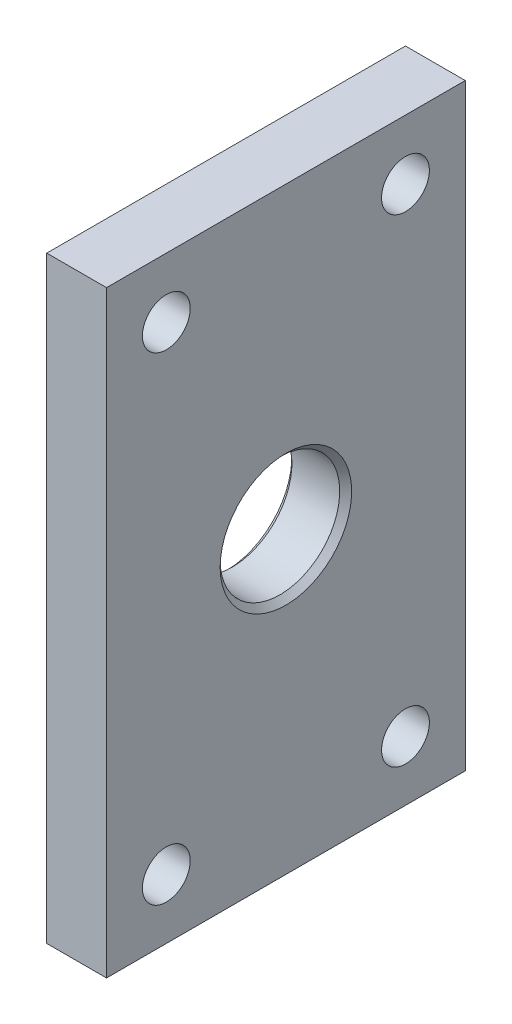
ISO-10303-21;
HEADER;
FILE_DESCRIPTION(('STEP AP214'),'2;1');
FILE_NAME('part.step','',(''),(''),'','','');
FILE_SCHEMA(('AUTOMOTIVE_DESIGN { 1 0 10303 214 1 1 1 1 }'));
ENDSEC;
DATA;
#1=APPLICATION_CONTEXT('core data for automotive mechanical design processes');
#2=APPLICATION_PROTOCOL_DEFINITION('international standard','automotive_design',2000,#1);
#3=PRODUCT_CONTEXT('',#1,'mechanical');
#4=PRODUCT('Part','Part','',(#3));
#5=PRODUCT_RELATED_PRODUCT_CATEGORY('part','',(#4));
#6=PRODUCT_DEFINITION_FORMATION('','',#4);
#7=PRODUCT_DEFINITION_CONTEXT('part definition',#1,'design');
#8=PRODUCT_DEFINITION('design','',#6,#7);
#9=PRODUCT_DEFINITION_SHAPE('','',#8);
#10=(LENGTH_UNIT() NAMED_UNIT(*) SI_UNIT(.MILLI.,.METRE.));
#11=(NAMED_UNIT(*) PLANE_ANGLE_UNIT() SI_UNIT($,.RADIAN.));
#12=(NAMED_UNIT(*) SI_UNIT($,.STERADIAN.) SOLID_ANGLE_UNIT());
#13=UNCERTAINTY_MEASURE_WITH_UNIT(LENGTH_MEASURE(1.E-05),#10,'distance_accuracy_value','');
#14=(GEOMETRIC_REPRESENTATION_CONTEXT(3) GLOBAL_UNCERTAINTY_ASSIGNED_CONTEXT((#13)) GLOBAL_UNIT_ASSIGNED_CONTEXT((#10,
#11,#12)) REPRESENTATION_CONTEXT('',''));
#15=CARTESIAN_POINT('',(0.,0.,0.));
#16=DIRECTION('',(0.,0.,1.));
#17=DIRECTION('',(1.,0.,0.));
#18=AXIS2_PLACEMENT_3D('',#15,#16,#17);
#19=CARTESIAN_POINT('',(10.,0.,0.));
#20=DIRECTION('',(0.,1.,0.));
#21=DIRECTION('',(0.,0.,1.));
#22=AXIS2_PLACEMENT_3D('',#19,#20,#21);
#23=PLANE('',#22);
#24=DIRECTION('',(0.,0.,-1.));
#25=VECTOR('',#24,1.);
#26=CARTESIAN_POINT('',(0.,0.,0.));
#27=LINE('',#26,#25);
#28=CARTESIAN_POINT('',(0.,0.,60.));
#29=VERTEX_POINT('',#28);
#30=CARTESIAN_POINT('',(0.,0.,0.));
#31=VERTEX_POINT('',#30);
#32=EDGE_CURVE('E114',#29,#31,#27,.T.);
#33=ORIENTED_EDGE('',*,*,#32,.T.);
#34=DIRECTION('',(-1.,0.,0.));
#35=VECTOR('',#34,1.);
#36=CARTESIAN_POINT('',(10.,0.,0.));
#37=LINE('',#36,#35);
#38=CARTESIAN_POINT('',(10.,0.,0.));
#39=VERTEX_POINT('',#38);
#40=EDGE_CURVE('E105',#39,#31,#37,.T.);
#41=ORIENTED_EDGE('',*,*,#40,.F.);
#42=DIRECTION('',(0.,0.,-1.));
#43=VECTOR('',#42,1.);
#44=CARTESIAN_POINT('',(10.,0.,0.));
#45=LINE('',#44,#43);
#46=CARTESIAN_POINT('',(10.,0.,60.));
#47=VERTEX_POINT('',#46);
#48=EDGE_CURVE('E99',#47,#39,#45,.T.);
#49=ORIENTED_EDGE('',*,*,#48,.F.);
#50=DIRECTION('',(-1.,0.,0.));
#51=VECTOR('',#50,1.);
#52=CARTESIAN_POINT('',(10.,0.,60.));
#53=LINE('',#52,#51);
#54=EDGE_CURVE('E110',#47,#29,#53,.T.);
#55=ORIENTED_EDGE('',*,*,#54,.T.);
#56=EDGE_LOOP('',(#33,#41,#49,#55));
#57=FACE_BOUND('',#56,.T.);
#58=ADVANCED_FACE('F45',(#57),#23,.F.);
#59=CARTESIAN_POINT('',(10.,0.,0.));
#60=DIRECTION('',(0.,0.,1.));
#61=DIRECTION('',(1.,0.,0.));
#62=AXIS2_PLACEMENT_3D('',#59,#60,#61);
#63=PLANE('',#62);
#64=DIRECTION('',(0.,1.,0.));
#65=VECTOR('',#64,1.);
#66=CARTESIAN_POINT('',(0.,0.,0.));
#67=LINE('',#66,#65);
#68=CARTESIAN_POINT('',(0.,100.,0.));
#69=VERTEX_POINT('',#68);
#70=EDGE_CURVE('E104',#31,#69,#67,.T.);
#71=ORIENTED_EDGE('',*,*,#70,.T.);
#72=DIRECTION('',(-1.,0.,0.));
#73=VECTOR('',#72,1.);
#74=CARTESIAN_POINT('',(10.,100.,0.));
#75=LINE('',#74,#73);
#76=CARTESIAN_POINT('',(10.,100.,0.));
#77=VERTEX_POINT('',#76);
#78=EDGE_CURVE('E102',#77,#69,#75,.T.);
#79=ORIENTED_EDGE('',*,*,#78,.F.);
#80=DIRECTION('',(0.,1.,0.));
#81=VECTOR('',#80,1.);
#82=CARTESIAN_POINT('',(10.,0.,0.));
#83=LINE('',#82,#81);
#84=EDGE_CURVE('E94',#39,#77,#83,.T.);
#85=ORIENTED_EDGE('',*,*,#84,.F.);
#86=ORIENTED_EDGE('',*,*,#40,.T.);
#87=EDGE_LOOP('',(#71,#79,#85,#86));
#88=FACE_BOUND('',#87,.T.);
#89=ADVANCED_FACE('F103',(#88),#63,.F.);
#90=CARTESIAN_POINT('',(10.,100.,0.));
#91=DIRECTION('',(0.,-1.,0.));
#92=DIRECTION('',(0.,0.,-1.));
#93=AXIS2_PLACEMENT_3D('',#90,#91,#92);
#94=PLANE('',#93);
#95=DIRECTION('',(0.,0.,1.));
#96=VECTOR('',#95,1.);
#97=CARTESIAN_POINT('',(0.,100.,0.));
#98=LINE('',#97,#96);
#99=CARTESIAN_POINT('',(0.,100.,60.));
#100=VERTEX_POINT('',#99);
#101=EDGE_CURVE('E80',#69,#100,#98,.T.);
#102=ORIENTED_EDGE('',*,*,#101,.T.);
#103=DIRECTION('',(-1.,0.,0.));
#104=VECTOR('',#103,1.);
#105=CARTESIAN_POINT('',(10.,100.,60.));
#106=LINE('',#105,#104);
#107=CARTESIAN_POINT('',(10.,100.,60.));
#108=VERTEX_POINT('',#107);
#109=EDGE_CURVE('E106',#108,#100,#106,.T.);
#110=ORIENTED_EDGE('',*,*,#109,.F.);
#111=DIRECTION('',(0.,0.,1.));
#112=VECTOR('',#111,1.);
#113=CARTESIAN_POINT('',(10.,100.,0.));
#114=LINE('',#113,#112);
#115=EDGE_CURVE('E97',#77,#108,#114,.T.);
#116=ORIENTED_EDGE('',*,*,#115,.F.);
#117=ORIENTED_EDGE('',*,*,#78,.T.);
#118=EDGE_LOOP('',(#102,#110,#116,#117));
#119=FACE_BOUND('',#118,.T.);
#120=ADVANCED_FACE('F108',(#119),#94,.F.);
#121=CARTESIAN_POINT('',(10.,0.,60.));
#122=DIRECTION('',(0.,0.,-1.));
#123=DIRECTION('',(-1.,0.,0.));
#124=AXIS2_PLACEMENT_3D('',#121,#122,#123);
#125=PLANE('',#124);
#126=DIRECTION('',(0.,-1.,0.));
#127=VECTOR('',#126,1.);
#128=CARTESIAN_POINT('',(0.,0.,60.));
#129=LINE('',#128,#127);
#130=EDGE_CURVE('E86',#100,#29,#129,.T.);
#131=ORIENTED_EDGE('',*,*,#130,.T.);
#132=ORIENTED_EDGE('',*,*,#54,.F.);
#133=DIRECTION('',(0.,-1.,0.));
#134=VECTOR('',#133,1.);
#135=CARTESIAN_POINT('',(10.,0.,60.));
#136=LINE('',#135,#134);
#137=EDGE_CURVE('E63',#108,#47,#136,.T.);
#138=ORIENTED_EDGE('',*,*,#137,.F.);
#139=ORIENTED_EDGE('',*,*,#109,.T.);
#140=EDGE_LOOP('',(#131,#132,#138,#139));
#141=FACE_BOUND('',#140,.T.);
#142=ADVANCED_FACE('F162',(#141),#125,.F.);
#143=CARTESIAN_POINT('',(10.,0.,0.));
#144=DIRECTION('',(-1.,0.,0.));
#145=DIRECTION('',(0.,0.,1.));
#146=AXIS2_PLACEMENT_3D('',#143,#144,#145);
#147=PLANE('',#146);
#148=CARTESIAN_POINT('',(10.,50.,30.));
#149=DIRECTION('',(-1.,0.,0.));
#150=DIRECTION('',(0.,0.,1.));
#151=AXIS2_PLACEMENT_3D('',#148,#149,#150);
#152=CIRCLE('',#151,11.);
#153=CARTESIAN_POINT('',(10.,50.,41.));
#154=VERTEX_POINT('',#153);
#155=EDGE_CURVE('E11',#154,#154,#152,.T.);
#156=ORIENTED_EDGE('',*,*,#155,.T.);
#157=EDGE_LOOP('',(#156));
#158=FACE_BOUND('',#157,.T.);
#159=CARTESIAN_POINT('',(10.,90.,10.));
#160=DIRECTION('',(1.,0.,0.));
#161=DIRECTION('',(0.,0.,-1.));
#162=AXIS2_PLACEMENT_3D('',#159,#160,#161);
#163=CIRCLE('',#162,4.00000000000001);
#164=CARTESIAN_POINT('',(10.,90.,5.99999999999999));
#165=VERTEX_POINT('',#164);
#166=EDGE_CURVE('E278',#165,#165,#163,.T.);
#167=ORIENTED_EDGE('',*,*,#166,.F.);
#168=EDGE_LOOP('',(#167));
#169=FACE_BOUND('',#168,.T.);
#170=CARTESIAN_POINT('',(10.,10.,50.));
#171=DIRECTION('',(1.,0.,0.));
#172=DIRECTION('',(0.,0.,-1.));
#173=AXIS2_PLACEMENT_3D('',#170,#171,#172);
#174=CIRCLE('',#173,4.);
#175=CARTESIAN_POINT('',(10.,10.,46.));
#176=VERTEX_POINT('',#175);
#177=EDGE_CURVE('E282',#176,#176,#174,.T.);
#178=ORIENTED_EDGE('',*,*,#177,.F.);
#179=EDGE_LOOP('',(#178));
#180=FACE_BOUND('',#179,.T.);
#181=CARTESIAN_POINT('',(10.,90.,50.));
#182=DIRECTION('',(1.,0.,0.));
#183=DIRECTION('',(0.,0.,-1.));
#184=AXIS2_PLACEMENT_3D('',#181,#182,#183);
#185=CIRCLE('',#184,4.00000000000001);
#186=CARTESIAN_POINT('',(10.,90.,46.));
#187=VERTEX_POINT('',#186);
#188=EDGE_CURVE('E286',#187,#187,#185,.T.);
#189=ORIENTED_EDGE('',*,*,#188,.F.);
#190=EDGE_LOOP('',(#189));
#191=FACE_BOUND('',#190,.T.);
#192=CARTESIAN_POINT('',(10.,10.,10.));
#193=DIRECTION('',(1.,0.,0.));
#194=DIRECTION('',(0.,0.,-1.));
#195=AXIS2_PLACEMENT_3D('',#192,#193,#194);
#196=CIRCLE('',#195,4.);
#197=CARTESIAN_POINT('',(10.,10.,6.));
#198=VERTEX_POINT('',#197);
#199=EDGE_CURVE('E289',#198,#198,#196,.T.);
#200=ORIENTED_EDGE('',*,*,#199,.F.);
#201=EDGE_LOOP('',(#200));
#202=FACE_BOUND('',#201,.T.);
#203=ORIENTED_EDGE('',*,*,#48,.T.);
#204=ORIENTED_EDGE('',*,*,#84,.T.);
#205=ORIENTED_EDGE('',*,*,#115,.T.);
#206=ORIENTED_EDGE('',*,*,#137,.T.);
#207=EDGE_LOOP('',(#203,#204,#205,#206));
#208=FACE_BOUND('',#207,.T.);
#209=ADVANCED_FACE('F95',(#158,#169,#180,#191,#202,#208),#147,.F.);
#210=CARTESIAN_POINT('',(0.,0.,0.));
#211=DIRECTION('',(-1.,0.,0.));
#212=DIRECTION('',(0.,0.,1.));
#213=AXIS2_PLACEMENT_3D('',#210,#211,#212);
#214=PLANE('',#213);
#215=CARTESIAN_POINT('',(0.,50.,30.));
#216=DIRECTION('',(-1.,0.,0.));
#217=DIRECTION('',(0.,0.,1.));
#218=AXIS2_PLACEMENT_3D('',#215,#216,#217);
#219=CIRCLE('',#218,11.);
#220=CARTESIAN_POINT('',(0.,50.,41.));
#221=VERTEX_POINT('',#220);
#222=EDGE_CURVE('E124',#221,#221,#219,.F.);
#223=ORIENTED_EDGE('',*,*,#222,.T.);
#224=EDGE_LOOP('',(#223));
#225=FACE_BOUND('',#224,.T.);
#226=CARTESIAN_POINT('',(0.,90.,10.));
#227=DIRECTION('',(1.,0.,0.));
#228=DIRECTION('',(0.,0.,-1.));
#229=AXIS2_PLACEMENT_3D('',#226,#227,#228);
#230=CIRCLE('',#229,4.00000000000001);
#231=CARTESIAN_POINT('',(0.,90.,5.99999999999999));
#232=VERTEX_POINT('',#231);
#233=EDGE_CURVE('E148',#232,#232,#230,.T.);
#234=ORIENTED_EDGE('',*,*,#233,.T.);
#235=EDGE_LOOP('',(#234));
#236=FACE_BOUND('',#235,.T.);
#237=CARTESIAN_POINT('',(0.,10.,50.));
#238=DIRECTION('',(1.,0.,0.));
#239=DIRECTION('',(0.,0.,-1.));
#240=AXIS2_PLACEMENT_3D('',#237,#238,#239);
#241=CIRCLE('',#240,4.);
#242=CARTESIAN_POINT('',(0.,10.,46.));
#243=VERTEX_POINT('',#242);
#244=EDGE_CURVE('E152',#243,#243,#241,.T.);
#245=ORIENTED_EDGE('',*,*,#244,.T.);
#246=EDGE_LOOP('',(#245));
#247=FACE_BOUND('',#246,.T.);
#248=CARTESIAN_POINT('',(0.,90.,50.));
#249=DIRECTION('',(1.,0.,0.));
#250=DIRECTION('',(0.,0.,-1.));
#251=AXIS2_PLACEMENT_3D('',#248,#249,#250);
#252=CIRCLE('',#251,4.00000000000001);
#253=CARTESIAN_POINT('',(0.,90.,46.));
#254=VERTEX_POINT('',#253);
#255=EDGE_CURVE('E156',#254,#254,#252,.T.);
#256=ORIENTED_EDGE('',*,*,#255,.T.);
#257=EDGE_LOOP('',(#256));
#258=FACE_BOUND('',#257,.T.);
#259=CARTESIAN_POINT('',(0.,10.,10.));
#260=DIRECTION('',(1.,0.,0.));
#261=DIRECTION('',(0.,0.,-1.));
#262=AXIS2_PLACEMENT_3D('',#259,#260,#261);
#263=CIRCLE('',#262,4.);
#264=CARTESIAN_POINT('',(0.,10.,6.));
#265=VERTEX_POINT('',#264);
#266=EDGE_CURVE('E117',#265,#265,#263,.T.);
#267=ORIENTED_EDGE('',*,*,#266,.T.);
#268=EDGE_LOOP('',(#267));
#269=FACE_BOUND('',#268,.T.);
#270=ORIENTED_EDGE('',*,*,#32,.F.);
#271=ORIENTED_EDGE('',*,*,#130,.F.);
#272=ORIENTED_EDGE('',*,*,#101,.F.);
#273=ORIENTED_EDGE('',*,*,#70,.F.);
#274=EDGE_LOOP('',(#270,#271,#272,#273));
#275=FACE_BOUND('',#274,.T.);
#276=ADVANCED_FACE('F140',(#225,#236,#247,#258,#269,#275),#214,.T.);
#277=CARTESIAN_POINT('',(0.,10.,10.));
#278=DIRECTION('',(1.,0.,0.));
#279=DIRECTION('',(0.,0.,-1.));
#280=AXIS2_PLACEMENT_3D('',#277,#278,#279);
#281=CYLINDRICAL_SURFACE('',#280,4.);
#282=ORIENTED_EDGE('',*,*,#266,.F.);
#283=EDGE_LOOP('',(#282));
#284=FACE_BOUND('',#283,.T.);
#285=ORIENTED_EDGE('',*,*,#199,.T.);
#286=EDGE_LOOP('',(#285));
#287=FACE_BOUND('',#286,.T.);
#288=ADVANCED_FACE('F143',(#284,#287),#281,.F.);
#289=CARTESIAN_POINT('',(0.,90.,50.));
#290=DIRECTION('',(1.,0.,0.));
#291=DIRECTION('',(0.,0.,-1.));
#292=AXIS2_PLACEMENT_3D('',#289,#290,#291);
#293=CYLINDRICAL_SURFACE('',#292,4.00000000000001);
#294=ORIENTED_EDGE('',*,*,#255,.F.);
#295=EDGE_LOOP('',(#294));
#296=FACE_BOUND('',#295,.T.);
#297=ORIENTED_EDGE('',*,*,#188,.T.);
#298=EDGE_LOOP('',(#297));
#299=FACE_BOUND('',#298,.T.);
#300=ADVANCED_FACE('F218',(#296,#299),#293,.F.);
#301=CARTESIAN_POINT('',(0.,10.,50.));
#302=DIRECTION('',(1.,0.,0.));
#303=DIRECTION('',(0.,0.,-1.));
#304=AXIS2_PLACEMENT_3D('',#301,#302,#303);
#305=CYLINDRICAL_SURFACE('',#304,4.);
#306=ORIENTED_EDGE('',*,*,#244,.F.);
#307=EDGE_LOOP('',(#306));
#308=FACE_BOUND('',#307,.T.);
#309=ORIENTED_EDGE('',*,*,#177,.T.);
#310=EDGE_LOOP('',(#309));
#311=FACE_BOUND('',#310,.T.);
#312=ADVANCED_FACE('F228',(#308,#311),#305,.F.);
#313=CARTESIAN_POINT('',(0.,90.,10.));
#314=DIRECTION('',(1.,0.,0.));
#315=DIRECTION('',(0.,0.,-1.));
#316=AXIS2_PLACEMENT_3D('',#313,#314,#315);
#317=CYLINDRICAL_SURFACE('',#316,4.00000000000001);
#318=ORIENTED_EDGE('',*,*,#233,.F.);
#319=EDGE_LOOP('',(#318));
#320=FACE_BOUND('',#319,.T.);
#321=ORIENTED_EDGE('',*,*,#166,.T.);
#322=EDGE_LOOP('',(#321));
#323=FACE_BOUND('',#322,.T.);
#324=ADVANCED_FACE('F238',(#320,#323),#317,.F.);
#325=CARTESIAN_POINT('',(0.,50.,30.));
#326=DIRECTION('',(1.,0.,0.));
#327=DIRECTION('',(0.,0.,-1.));
#328=AXIS2_PLACEMENT_3D('',#325,#326,#327);
#329=CYLINDRICAL_SURFACE('',#328,10.);
#330=CARTESIAN_POINT('',(1.00000000000002,50.,30.));
#331=DIRECTION('',(-1.,0.,0.));
#332=DIRECTION('',(0.,0.,1.));
#333=AXIS2_PLACEMENT_3D('',#330,#331,#332);
#334=CIRCLE('',#333,10.);
#335=CARTESIAN_POINT('',(1.00000000000002,50.,40.));
#336=VERTEX_POINT('',#335);
#337=EDGE_CURVE('E55',#336,#336,#334,.T.);
#338=ORIENTED_EDGE('',*,*,#337,.T.);
#339=EDGE_LOOP('',(#338));
#340=FACE_BOUND('',#339,.T.);
#341=CARTESIAN_POINT('',(9.00000000000002,50.,30.));
#342=DIRECTION('',(-1.,0.,0.));
#343=DIRECTION('',(0.,0.,1.));
#344=AXIS2_PLACEMENT_3D('',#341,#342,#343);
#345=CIRCLE('',#344,10.);
#346=CARTESIAN_POINT('',(9.00000000000002,50.,40.));
#347=VERTEX_POINT('',#346);
#348=EDGE_CURVE('E127',#347,#347,#345,.F.);
#349=ORIENTED_EDGE('',*,*,#348,.T.);
#350=EDGE_LOOP('',(#349));
#351=FACE_BOUND('',#350,.T.);
#352=ADVANCED_FACE('F132',(#340,#351),#329,.F.);
#353=CARTESIAN_POINT('',(0.,50.,30.));
#354=DIRECTION('',(-1.,0.,0.));
#355=DIRECTION('',(0.,0.,1.));
#356=AXIS2_PLACEMENT_3D('',#353,#354,#355);
#357=CONICAL_SURFACE('',#356,11.,0.785398163397441);
#358=ORIENTED_EDGE('',*,*,#337,.F.);
#359=EDGE_LOOP('',(#358));
#360=FACE_BOUND('',#359,.T.);
#361=ORIENTED_EDGE('',*,*,#222,.F.);
#362=EDGE_LOOP('',(#361));
#363=FACE_BOUND('',#362,.T.);
#364=ADVANCED_FACE('F135',(#360,#363),#357,.F.);
#365=CARTESIAN_POINT('',(9.00000000000002,50.,30.));
#366=DIRECTION('',(1.,0.,0.));
#367=DIRECTION('',(0.,0.,-1.));
#368=AXIS2_PLACEMENT_3D('',#365,#366,#367);
#369=CONICAL_SURFACE('',#368,10.,0.785398163397455);
#370=ORIENTED_EDGE('',*,*,#155,.F.);
#371=EDGE_LOOP('',(#370));
#372=FACE_BOUND('',#371,.T.);
#373=ORIENTED_EDGE('',*,*,#348,.F.);
#374=EDGE_LOOP('',(#373));
#375=FACE_BOUND('',#374,.T.);
#376=ADVANCED_FACE('F48',(#372,#375),#369,.F.);
#377=CLOSED_SHELL('',(#58,#89,#120,#142,#209,#276,#288,#300,#312,#324,#352,#364,#376));
#378=MANIFOLD_SOLID_BREP('B2',#377);
#379=ADVANCED_BREP_SHAPE_REPRESENTATION('',(#18,#378),#14);
#380=SHAPE_DEFINITION_REPRESENTATION(#9,#379);
ENDSEC;
END-ISO-10303-21;
